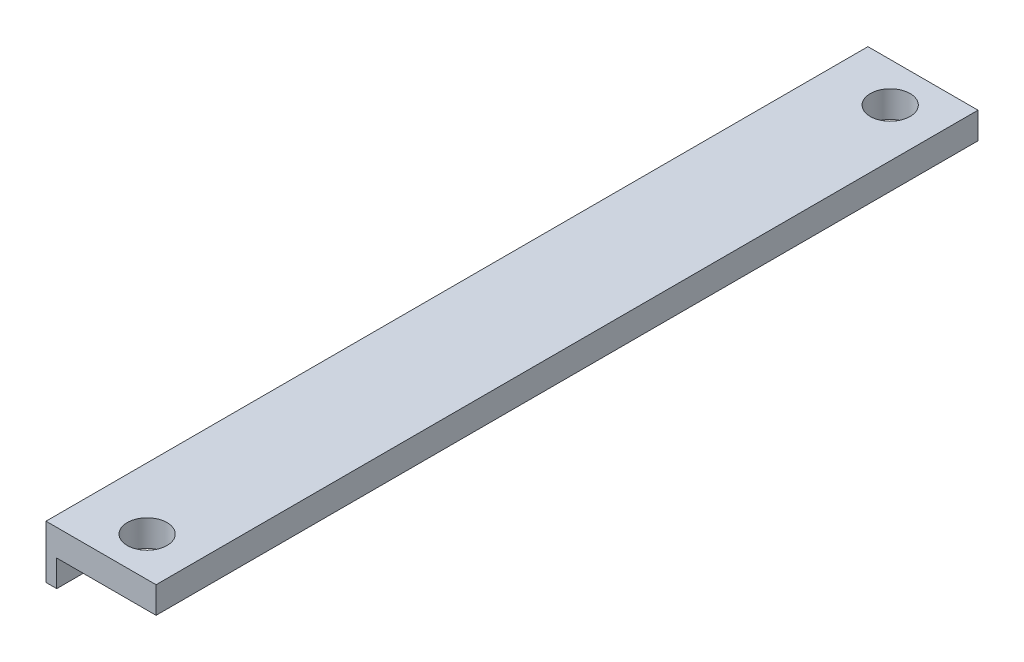
ISO-10303-21;
HEADER;
FILE_DESCRIPTION(('STEP AP214'),'2;1');
FILE_NAME('part.step','',(''),(''),'','','');
FILE_SCHEMA(('AUTOMOTIVE_DESIGN { 1 0 10303 214 1 1 1 1 }'));
ENDSEC;
DATA;
#1=APPLICATION_CONTEXT('core data for automotive mechanical design processes');
#2=APPLICATION_PROTOCOL_DEFINITION('international standard','automotive_design',2000,#1);
#3=PRODUCT_CONTEXT('',#1,'mechanical');
#4=PRODUCT('Part','Part','',(#3));
#5=PRODUCT_RELATED_PRODUCT_CATEGORY('part','',(#4));
#6=PRODUCT_DEFINITION_FORMATION('','',#4);
#7=PRODUCT_DEFINITION_CONTEXT('part definition',#1,'design');
#8=PRODUCT_DEFINITION('design','',#6,#7);
#9=PRODUCT_DEFINITION_SHAPE('','',#8);
#10=(LENGTH_UNIT() NAMED_UNIT(*) SI_UNIT(.MILLI.,.METRE.));
#11=(NAMED_UNIT(*) PLANE_ANGLE_UNIT() SI_UNIT($,.RADIAN.));
#12=(NAMED_UNIT(*) SI_UNIT($,.STERADIAN.) SOLID_ANGLE_UNIT());
#13=UNCERTAINTY_MEASURE_WITH_UNIT(LENGTH_MEASURE(1.E-05),#10,'distance_accuracy_value','');
#14=(GEOMETRIC_REPRESENTATION_CONTEXT(3) GLOBAL_UNCERTAINTY_ASSIGNED_CONTEXT((#13)) GLOBAL_UNIT_ASSIGNED_CONTEXT((#10,
#11,#12)) REPRESENTATION_CONTEXT('',''));
#15=CARTESIAN_POINT('',(0.,0.,0.));
#16=DIRECTION('',(0.,0.,1.));
#17=DIRECTION('',(1.,0.,0.));
#18=AXIS2_PLACEMENT_3D('',#15,#16,#17);
#19=CARTESIAN_POINT('',(-54.7619801246486,2.,-30.9683720930233));
#20=DIRECTION('',(0.,0.,1.));
#21=DIRECTION('',(1.,0.,0.));
#22=AXIS2_PLACEMENT_3D('',#19,#20,#21);
#23=PLANE('',#22);
#24=DIRECTION('',(-1.,0.,0.));
#25=VECTOR('',#24,1.);
#26=CARTESIAN_POINT('',(-54.7619801246486,2.,-30.9683720930233));
#27=LINE('',#26,#25);
#28=CARTESIAN_POINT('',(-47.2762547000235,2.,-30.9683720930233));
#29=VERTEX_POINT('',#28);
#30=CARTESIAN_POINT('',(-55.5705360459158,2.,-30.9683720930233));
#31=VERTEX_POINT('',#30);
#32=EDGE_CURVE('E166',#29,#31,#27,.T.);
#33=ORIENTED_EDGE('',*,*,#32,.F.);
#34=DIRECTION('',(0.,1.,0.));
#35=VECTOR('',#34,1.);
#36=CARTESIAN_POINT('',(-47.2762547000235,-8.,-30.9683720930233));
#37=LINE('',#36,#35);
#38=CARTESIAN_POINT('',(-47.2762547000235,0.,-30.9683720930233));
#39=VERTEX_POINT('',#38);
#40=EDGE_CURVE('E145',#39,#29,#37,.T.);
#41=ORIENTED_EDGE('',*,*,#40,.F.);
#42=DIRECTION('',(-1.,0.,0.));
#43=VECTOR('',#42,1.);
#44=CARTESIAN_POINT('',(-54.7619801246486,0.,-30.9683720930233));
#45=LINE('',#44,#43);
#46=CARTESIAN_POINT('',(-54.7619801246486,0.,-30.9683720930233));
#47=VERTEX_POINT('',#46);
#48=EDGE_CURVE('E67',#39,#47,#45,.T.);
#49=ORIENTED_EDGE('',*,*,#48,.T.);
#50=DIRECTION('',(0.,1.,0.));
#51=VECTOR('',#50,1.);
#52=CARTESIAN_POINT('',(-54.7619801246486,-2.,-30.9683720930233));
#53=LINE('',#52,#51);
#54=CARTESIAN_POINT('',(-54.7619801246486,-2.,-30.9683720930233));
#55=VERTEX_POINT('',#54);
#56=EDGE_CURVE('E97',#55,#47,#53,.T.);
#57=ORIENTED_EDGE('',*,*,#56,.F.);
#58=DIRECTION('',(-1.,0.,0.));
#59=VECTOR('',#58,1.);
#60=CARTESIAN_POINT('',(-54.7619801246486,-2.,-30.9683720930233));
#61=LINE('',#60,#59);
#62=CARTESIAN_POINT('',(-55.5705360459158,-2.,-30.9683720930233));
#63=VERTEX_POINT('',#62);
#64=EDGE_CURVE('E101',#55,#63,#61,.T.);
#65=ORIENTED_EDGE('',*,*,#64,.T.);
#66=DIRECTION('',(0.,1.,0.));
#67=VECTOR('',#66,1.);
#68=CARTESIAN_POINT('',(-55.5705360459158,-2.,-30.9683720930233));
#69=LINE('',#68,#67);
#70=EDGE_CURVE('E106',#63,#31,#69,.T.);
#71=ORIENTED_EDGE('',*,*,#70,.T.);
#72=EDGE_LOOP('',(#33,#41,#49,#57,#65,#71));
#73=FACE_BOUND('',#72,.T.);
#74=ADVANCED_FACE('F45',(#73),#23,.F.);
#75=CARTESIAN_POINT('',(-54.7619801246486,2.,30.9683720930233));
#76=DIRECTION('',(0.,0.,-1.));
#77=DIRECTION('',(-1.,0.,0.));
#78=AXIS2_PLACEMENT_3D('',#75,#76,#77);
#79=PLANE('',#78);
#80=DIRECTION('',(1.,0.,0.));
#81=VECTOR('',#80,1.);
#82=CARTESIAN_POINT('',(-54.7619801246486,0.,30.9683720930233));
#83=LINE('',#82,#81);
#84=CARTESIAN_POINT('',(-54.7619801246486,0.,30.9683720930233));
#85=VERTEX_POINT('',#84);
#86=CARTESIAN_POINT('',(-47.2762547000235,0.,30.9683720930233));
#87=VERTEX_POINT('',#86);
#88=EDGE_CURVE('E169',#85,#87,#83,.T.);
#89=ORIENTED_EDGE('',*,*,#88,.T.);
#90=DIRECTION('',(0.,1.,0.));
#91=VECTOR('',#90,1.);
#92=CARTESIAN_POINT('',(-47.2762547000235,-8.,30.9683720930233));
#93=LINE('',#92,#91);
#94=CARTESIAN_POINT('',(-47.2762547000235,2.,30.9683720930233));
#95=VERTEX_POINT('',#94);
#96=EDGE_CURVE('E60',#87,#95,#93,.T.);
#97=ORIENTED_EDGE('',*,*,#96,.T.);
#98=DIRECTION('',(1.,0.,0.));
#99=VECTOR('',#98,1.);
#100=CARTESIAN_POINT('',(-54.7619801246486,2.,30.9683720930233));
#101=LINE('',#100,#99);
#102=CARTESIAN_POINT('',(-55.5705360459158,2.,30.9683720930233));
#103=VERTEX_POINT('',#102);
#104=EDGE_CURVE('E53',#103,#95,#101,.T.);
#105=ORIENTED_EDGE('',*,*,#104,.F.);
#106=DIRECTION('',(0.,1.,0.));
#107=VECTOR('',#106,1.);
#108=CARTESIAN_POINT('',(-55.5705360459158,-2.,30.9683720930233));
#109=LINE('',#108,#107);
#110=CARTESIAN_POINT('',(-55.5705360459158,-2.,30.9683720930233));
#111=VERTEX_POINT('',#110);
#112=EDGE_CURVE('E137',#111,#103,#109,.T.);
#113=ORIENTED_EDGE('',*,*,#112,.F.);
#114=DIRECTION('',(1.,0.,0.));
#115=VECTOR('',#114,1.);
#116=CARTESIAN_POINT('',(-55.5705360459158,-2.,30.9683720930233));
#117=LINE('',#116,#115);
#118=CARTESIAN_POINT('',(-54.7619801246486,-2.,30.9683720930233));
#119=VERTEX_POINT('',#118);
#120=EDGE_CURVE('E107',#111,#119,#117,.T.);
#121=ORIENTED_EDGE('',*,*,#120,.T.);
#122=DIRECTION('',(0.,1.,0.));
#123=VECTOR('',#122,1.);
#124=CARTESIAN_POINT('',(-54.7619801246486,-2.,30.9683720930233));
#125=LINE('',#124,#123);
#126=EDGE_CURVE('E122',#119,#85,#125,.T.);
#127=ORIENTED_EDGE('',*,*,#126,.T.);
#128=EDGE_LOOP('',(#89,#97,#105,#113,#121,#127));
#129=FACE_BOUND('',#128,.T.);
#130=ADVANCED_FACE('F180',(#129),#79,.F.);
#131=CARTESIAN_POINT('',(0.,2.,0.));
#132=DIRECTION('',(0.,1.,0.));
#133=DIRECTION('',(0.,0.,1.));
#134=AXIS2_PLACEMENT_3D('',#131,#132,#133);
#135=PLANE('',#134);
#136=DIRECTION('',(0.,0.,1.));
#137=VECTOR('',#136,1.);
#138=CARTESIAN_POINT('',(-47.2762547000235,2.,-30.9683720930233));
#139=LINE('',#138,#137);
#140=EDGE_CURVE('E136',#29,#95,#139,.T.);
#141=ORIENTED_EDGE('',*,*,#140,.F.);
#142=ORIENTED_EDGE('',*,*,#32,.T.);
#143=DIRECTION('',(0.,0.,1.));
#144=VECTOR('',#143,1.);
#145=CARTESIAN_POINT('',(-55.5705360459158,2.,-30.9683720930233));
#146=LINE('',#145,#144);
#147=EDGE_CURVE('E124',#31,#103,#146,.T.);
#148=ORIENTED_EDGE('',*,*,#147,.T.);
#149=ORIENTED_EDGE('',*,*,#104,.T.);
#150=EDGE_LOOP('',(#141,#142,#148,#149));
#151=FACE_BOUND('',#150,.T.);
#152=CARTESIAN_POINT('',(-50.9215728752538,2.,27.9965728752538));
#153=DIRECTION('',(0.,-1.,0.));
#154=DIRECTION('',(0.,0.,-1.));
#155=AXIS2_PLACEMENT_3D('',#152,#153,#154);
#156=CIRCLE('',#155,1.5);
#157=CARTESIAN_POINT('',(-50.9215728752538,2.,26.4965728752538));
#158=VERTEX_POINT('',#157);
#159=EDGE_CURVE('E148',#158,#158,#156,.T.);
#160=ORIENTED_EDGE('',*,*,#159,.T.);
#161=EDGE_LOOP('',(#160));
#162=FACE_BOUND('',#161,.T.);
#163=CARTESIAN_POINT('',(-50.9215728752538,2.,-27.9965728752538));
#164=DIRECTION('',(0.,1.,0.));
#165=DIRECTION('',(0.,0.,1.));
#166=AXIS2_PLACEMENT_3D('',#163,#164,#165);
#167=CIRCLE('',#166,1.5);
#168=CARTESIAN_POINT('',(-50.9215728752538,2.,-26.4965728752538));
#169=VERTEX_POINT('',#168);
#170=EDGE_CURVE('E155',#169,#169,#167,.T.);
#171=ORIENTED_EDGE('',*,*,#170,.F.);
#172=EDGE_LOOP('',(#171));
#173=FACE_BOUND('',#172,.T.);
#174=ADVANCED_FACE('F187',(#151,#162,#173),#135,.T.);
#175=CARTESIAN_POINT('',(0.,0.,0.));
#176=DIRECTION('',(0.,1.,0.));
#177=DIRECTION('',(0.,0.,1.));
#178=AXIS2_PLACEMENT_3D('',#175,#176,#177);
#179=PLANE('',#178);
#180=CARTESIAN_POINT('',(-50.9215728752538,0.,27.9965728752538));
#181=DIRECTION('',(0.,-1.,0.));
#182=DIRECTION('',(0.,0.,-1.));
#183=AXIS2_PLACEMENT_3D('',#180,#181,#182);
#184=CIRCLE('',#183,1.5);
#185=CARTESIAN_POINT('',(-50.9215728752538,0.,26.4965728752538));
#186=VERTEX_POINT('',#185);
#187=EDGE_CURVE('E151',#186,#186,#184,.T.);
#188=ORIENTED_EDGE('',*,*,#187,.F.);
#189=EDGE_LOOP('',(#188));
#190=FACE_BOUND('',#189,.T.);
#191=CARTESIAN_POINT('',(-50.9215728752538,0.,-27.9965728752538));
#192=DIRECTION('',(0.,1.,0.));
#193=DIRECTION('',(0.,0.,1.));
#194=AXIS2_PLACEMENT_3D('',#191,#192,#193);
#195=CIRCLE('',#194,1.5);
#196=CARTESIAN_POINT('',(-50.9215728752538,0.,-26.4965728752538));
#197=VERTEX_POINT('',#196);
#198=EDGE_CURVE('E159',#197,#197,#195,.T.);
#199=ORIENTED_EDGE('',*,*,#198,.T.);
#200=EDGE_LOOP('',(#199));
#201=FACE_BOUND('',#200,.T.);
#202=ORIENTED_EDGE('',*,*,#48,.F.);
#203=DIRECTION('',(0.,0.,1.));
#204=VECTOR('',#203,1.);
#205=CARTESIAN_POINT('',(-47.2762547000235,0.,0.));
#206=LINE('',#205,#204);
#207=EDGE_CURVE('E11',#39,#87,#206,.T.);
#208=ORIENTED_EDGE('',*,*,#207,.T.);
#209=ORIENTED_EDGE('',*,*,#88,.F.);
#210=DIRECTION('',(0.,0.,1.));
#211=VECTOR('',#210,1.);
#212=CARTESIAN_POINT('',(-54.7619801246486,0.,-30.9683720930233));
#213=LINE('',#212,#211);
#214=EDGE_CURVE('E175',#47,#85,#213,.T.);
#215=ORIENTED_EDGE('',*,*,#214,.F.);
#216=EDGE_LOOP('',(#202,#208,#209,#215));
#217=FACE_BOUND('',#216,.T.);
#218=ADVANCED_FACE('F182',(#190,#201,#217),#179,.F.);
#219=CARTESIAN_POINT('',(-50.9215728752538,0.,-27.9965728752538));
#220=DIRECTION('',(0.,1.,0.));
#221=DIRECTION('',(0.,0.,1.));
#222=AXIS2_PLACEMENT_3D('',#219,#220,#221);
#223=CYLINDRICAL_SURFACE('',#222,1.5);
#224=ORIENTED_EDGE('',*,*,#198,.F.);
#225=EDGE_LOOP('',(#224));
#226=FACE_BOUND('',#225,.T.);
#227=ORIENTED_EDGE('',*,*,#170,.T.);
#228=EDGE_LOOP('',(#227));
#229=FACE_BOUND('',#228,.T.);
#230=ADVANCED_FACE('F210',(#226,#229),#223,.F.);
#231=CARTESIAN_POINT('',(-50.9215728752538,0.,27.9965728752538));
#232=DIRECTION('',(0.,1.,0.));
#233=DIRECTION('',(0.,0.,1.));
#234=AXIS2_PLACEMENT_3D('',#231,#232,#233);
#235=CYLINDRICAL_SURFACE('',#234,1.5);
#236=ORIENTED_EDGE('',*,*,#187,.T.);
#237=EDGE_LOOP('',(#236));
#238=FACE_BOUND('',#237,.T.);
#239=ORIENTED_EDGE('',*,*,#159,.F.);
#240=EDGE_LOOP('',(#239));
#241=FACE_BOUND('',#240,.T.);
#242=ADVANCED_FACE('F215',(#238,#241),#235,.F.);
#243=CARTESIAN_POINT('',(-47.2762547000235,-8.,-30.9683720930233));
#244=DIRECTION('',(-1.,0.,0.));
#245=DIRECTION('',(0.,0.,1.));
#246=AXIS2_PLACEMENT_3D('',#243,#244,#245);
#247=PLANE('',#246);
#248=ORIENTED_EDGE('',*,*,#40,.T.);
#249=ORIENTED_EDGE('',*,*,#140,.T.);
#250=ORIENTED_EDGE('',*,*,#96,.F.);
#251=ORIENTED_EDGE('',*,*,#207,.F.);
#252=EDGE_LOOP('',(#248,#249,#250,#251));
#253=FACE_BOUND('',#252,.T.);
#254=ADVANCED_FACE('F183',(#253),#247,.F.);
#255=CARTESIAN_POINT('',(-54.7619801246486,-2.,30.9683720930233));
#256=DIRECTION('',(1.,0.,0.));
#257=DIRECTION('',(0.,0.,-1.));
#258=AXIS2_PLACEMENT_3D('',#255,#256,#257);
#259=PLANE('',#258);
#260=ORIENTED_EDGE('',*,*,#56,.T.);
#261=ORIENTED_EDGE('',*,*,#214,.T.);
#262=ORIENTED_EDGE('',*,*,#126,.F.);
#263=DIRECTION('',(0.,0.,-1.));
#264=VECTOR('',#263,1.);
#265=CARTESIAN_POINT('',(-54.7619801246486,-2.,30.9683720930233));
#266=LINE('',#265,#264);
#267=EDGE_CURVE('E114',#119,#55,#266,.T.);
#268=ORIENTED_EDGE('',*,*,#267,.T.);
#269=EDGE_LOOP('',(#260,#261,#262,#268));
#270=FACE_BOUND('',#269,.T.);
#271=ADVANCED_FACE('F120',(#270),#259,.T.);
#272=CARTESIAN_POINT('',(-55.5705360459158,-2.,-30.9683720930233));
#273=DIRECTION('',(-1.,0.,0.));
#274=DIRECTION('',(0.,0.,1.));
#275=AXIS2_PLACEMENT_3D('',#272,#273,#274);
#276=PLANE('',#275);
#277=ORIENTED_EDGE('',*,*,#147,.F.);
#278=ORIENTED_EDGE('',*,*,#70,.F.);
#279=DIRECTION('',(0.,0.,1.));
#280=VECTOR('',#279,1.);
#281=CARTESIAN_POINT('',(-55.5705360459158,-2.,-30.9683720930233));
#282=LINE('',#281,#280);
#283=EDGE_CURVE('E117',#63,#111,#282,.T.);
#284=ORIENTED_EDGE('',*,*,#283,.T.);
#285=ORIENTED_EDGE('',*,*,#112,.T.);
#286=EDGE_LOOP('',(#277,#278,#284,#285));
#287=FACE_BOUND('',#286,.T.);
#288=ADVANCED_FACE('F190',(#287),#276,.T.);
#289=CARTESIAN_POINT('',(0.,-2.,0.));
#290=DIRECTION('',(0.,1.,0.));
#291=DIRECTION('',(0.,0.,1.));
#292=AXIS2_PLACEMENT_3D('',#289,#290,#291);
#293=PLANE('',#292);
#294=ORIENTED_EDGE('',*,*,#267,.F.);
#295=ORIENTED_EDGE('',*,*,#120,.F.);
#296=ORIENTED_EDGE('',*,*,#283,.F.);
#297=ORIENTED_EDGE('',*,*,#64,.F.);
#298=EDGE_LOOP('',(#294,#295,#296,#297));
#299=FACE_BOUND('',#298,.T.);
#300=ADVANCED_FACE('F112',(#299),#293,.F.);
#301=CLOSED_SHELL('',(#74,#130,#174,#218,#230,#242,#254,#271,#288,#300));
#302=MANIFOLD_SOLID_BREP('B2',#301);
#303=ADVANCED_BREP_SHAPE_REPRESENTATION('',(#18,#302),#14);
#304=SHAPE_DEFINITION_REPRESENTATION(#9,#303);
ENDSEC;
END-ISO-10303-21;
